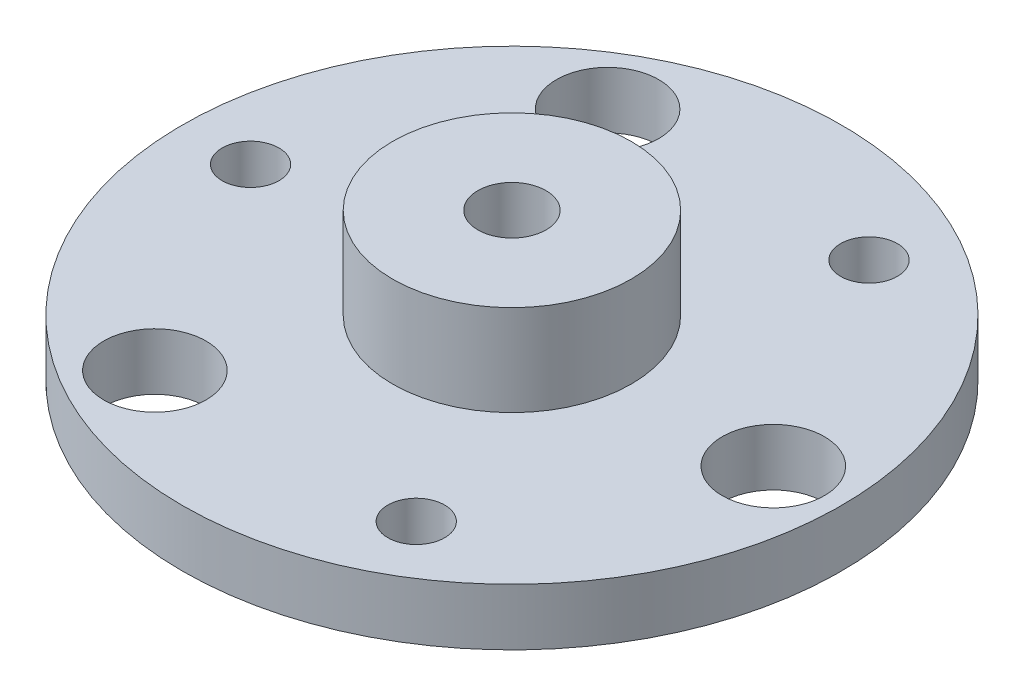
ISO-10303-21;
HEADER;
FILE_DESCRIPTION(('STEP AP214'),'2;1');
FILE_NAME('part.step','',(''),(''),'','','');
FILE_SCHEMA(('AUTOMOTIVE_DESIGN { 1 0 10303 214 1 1 1 1 }'));
ENDSEC;
DATA;
#1=APPLICATION_CONTEXT('core data for automotive mechanical design processes');
#2=APPLICATION_PROTOCOL_DEFINITION('international standard','automotive_design',2000,#1);
#3=PRODUCT_CONTEXT('',#1,'mechanical');
#4=PRODUCT('Part','Part','',(#3));
#5=PRODUCT_RELATED_PRODUCT_CATEGORY('part','',(#4));
#6=PRODUCT_DEFINITION_FORMATION('','',#4);
#7=PRODUCT_DEFINITION_CONTEXT('part definition',#1,'design');
#8=PRODUCT_DEFINITION('design','',#6,#7);
#9=PRODUCT_DEFINITION_SHAPE('','',#8);
#10=(LENGTH_UNIT() NAMED_UNIT(*) SI_UNIT(.MILLI.,.METRE.));
#11=(NAMED_UNIT(*) PLANE_ANGLE_UNIT() SI_UNIT($,.RADIAN.));
#12=(NAMED_UNIT(*) SI_UNIT($,.STERADIAN.) SOLID_ANGLE_UNIT());
#13=UNCERTAINTY_MEASURE_WITH_UNIT(LENGTH_MEASURE(1.E-05),#10,'distance_accuracy_value','');
#14=(GEOMETRIC_REPRESENTATION_CONTEXT(3) GLOBAL_UNCERTAINTY_ASSIGNED_CONTEXT((#13)) GLOBAL_UNIT_ASSIGNED_CONTEXT((#10,
#11,#12)) REPRESENTATION_CONTEXT('',''));
#15=CARTESIAN_POINT('',(0.,0.,0.));
#16=DIRECTION('',(0.,0.,1.));
#17=DIRECTION('',(1.,0.,0.));
#18=AXIS2_PLACEMENT_3D('',#15,#16,#17);
#19=CARTESIAN_POINT('',(0.,5.,0.));
#20=DIRECTION('',(0.,-1.,0.));
#21=DIRECTION('',(0.,0.,-1.));
#22=AXIS2_PLACEMENT_3D('',#19,#20,#21);
#23=CYLINDRICAL_SURFACE('',#22,29.);
#24=CARTESIAN_POINT('',(0.,5.,0.));
#25=DIRECTION('',(0.,1.,0.));
#26=DIRECTION('',(0.,0.,1.));
#27=AXIS2_PLACEMENT_3D('',#24,#25,#26);
#28=CIRCLE('',#27,29.);
#29=CARTESIAN_POINT('',(0.,5.,29.));
#30=VERTEX_POINT('',#29);
#31=EDGE_CURVE('E51',#30,#30,#28,.T.);
#32=ORIENTED_EDGE('',*,*,#31,.F.);
#33=EDGE_LOOP('',(#32));
#34=FACE_BOUND('',#33,.T.);
#35=CARTESIAN_POINT('',(0.,0.,0.));
#36=DIRECTION('',(0.,1.,0.));
#37=DIRECTION('',(0.,0.,1.));
#38=AXIS2_PLACEMENT_3D('',#35,#36,#37);
#39=CIRCLE('',#38,29.);
#40=CARTESIAN_POINT('',(0.,0.,29.));
#41=VERTEX_POINT('',#40);
#42=EDGE_CURVE('E55',#41,#41,#39,.T.);
#43=ORIENTED_EDGE('',*,*,#42,.T.);
#44=EDGE_LOOP('',(#43));
#45=FACE_BOUND('',#44,.T.);
#46=ADVANCED_FACE('F37',(#34,#45),#23,.T.);
#47=CARTESIAN_POINT('',(0.,5.,0.));
#48=DIRECTION('',(0.,1.,0.));
#49=DIRECTION('',(0.,0.,1.));
#50=AXIS2_PLACEMENT_3D('',#47,#48,#49);
#51=PLANE('',#50);
#52=CARTESIAN_POINT('',(-11.4999999999999,5.,19.9185842870421));
#53=DIRECTION('',(0.,1.,0.));
#54=DIRECTION('',(0.,0.,1.));
#55=AXIS2_PLACEMENT_3D('',#52,#53,#54);
#56=CIRCLE('',#55,4.5);
#57=CARTESIAN_POINT('',(-11.4999999999999,5.,24.4185842870421));
#58=VERTEX_POINT('',#57);
#59=EDGE_CURVE('E75',#58,#58,#56,.T.);
#60=ORIENTED_EDGE('',*,*,#59,.F.);
#61=EDGE_LOOP('',(#60));
#62=FACE_BOUND('',#61,.T.);
#63=CARTESIAN_POINT('',(-11.5000000000001,5.,-19.9185842870421));
#64=DIRECTION('',(0.,1.,0.));
#65=DIRECTION('',(0.,0.,1.));
#66=AXIS2_PLACEMENT_3D('',#63,#64,#65);
#67=CIRCLE('',#66,4.5);
#68=CARTESIAN_POINT('',(-11.5000000000001,5.,-15.4185842870421));
#69=VERTEX_POINT('',#68);
#70=EDGE_CURVE('E289',#69,#69,#67,.T.);
#71=ORIENTED_EDGE('',*,*,#70,.F.);
#72=EDGE_LOOP('',(#71));
#73=FACE_BOUND('',#72,.T.);
#74=CARTESIAN_POINT('',(23.,5.,0.));
#75=DIRECTION('',(0.,1.,0.));
#76=DIRECTION('',(0.,0.,1.));
#77=AXIS2_PLACEMENT_3D('',#74,#75,#76);
#78=CIRCLE('',#77,4.5);
#79=CARTESIAN_POINT('',(23.,5.,4.49999999999992));
#80=VERTEX_POINT('',#79);
#81=EDGE_CURVE('E285',#80,#80,#78,.T.);
#82=ORIENTED_EDGE('',*,*,#81,.F.);
#83=EDGE_LOOP('',(#82));
#84=FACE_BOUND('',#83,.T.);
#85=CARTESIAN_POINT('',(-23.,5.,0.));
#86=DIRECTION('',(0.,1.,0.));
#87=DIRECTION('',(0.,0.,1.));
#88=AXIS2_PLACEMENT_3D('',#85,#86,#87);
#89=CIRCLE('',#88,2.5);
#90=CARTESIAN_POINT('',(-23.,5.,2.5));
#91=VERTEX_POINT('',#90);
#92=EDGE_CURVE('E62',#91,#91,#89,.T.);
#93=ORIENTED_EDGE('',*,*,#92,.F.);
#94=EDGE_LOOP('',(#93));
#95=FACE_BOUND('',#94,.T.);
#96=CARTESIAN_POINT('',(11.5000000000004,5.,-19.9185842870419));
#97=DIRECTION('',(0.,1.,0.));
#98=DIRECTION('',(0.,0.,1.));
#99=AXIS2_PLACEMENT_3D('',#96,#97,#98);
#100=CIRCLE('',#99,2.5);
#101=CARTESIAN_POINT('',(11.5000000000004,5.,-17.4185842870419));
#102=VERTEX_POINT('',#101);
#103=EDGE_CURVE('E87',#102,#102,#100,.T.);
#104=ORIENTED_EDGE('',*,*,#103,.F.);
#105=EDGE_LOOP('',(#104));
#106=FACE_BOUND('',#105,.T.);
#107=CARTESIAN_POINT('',(11.5,5.,19.9185842870421));
#108=DIRECTION('',(0.,1.,0.));
#109=DIRECTION('',(0.,0.,1.));
#110=AXIS2_PLACEMENT_3D('',#107,#108,#109);
#111=CIRCLE('',#110,2.50000000000038);
#112=CARTESIAN_POINT('',(11.5,5.,22.4185842870425));
#113=VERTEX_POINT('',#112);
#114=EDGE_CURVE('E82',#113,#113,#111,.T.);
#115=ORIENTED_EDGE('',*,*,#114,.F.);
#116=EDGE_LOOP('',(#115));
#117=FACE_BOUND('',#116,.T.);
#118=CARTESIAN_POINT('',(0.,5.,0.));
#119=DIRECTION('',(0.,1.,0.));
#120=DIRECTION('',(0.,0.,1.));
#121=AXIS2_PLACEMENT_3D('',#118,#119,#120);
#122=CIRCLE('',#121,10.5);
#123=CARTESIAN_POINT('',(0.,5.,10.5));
#124=VERTEX_POINT('',#123);
#125=EDGE_CURVE('E45',#124,#124,#122,.T.);
#126=ORIENTED_EDGE('',*,*,#125,.F.);
#127=EDGE_LOOP('',(#126));
#128=FACE_BOUND('',#127,.T.);
#129=ORIENTED_EDGE('',*,*,#31,.T.);
#130=EDGE_LOOP('',(#129));
#131=FACE_BOUND('',#130,.T.);
#132=ADVANCED_FACE('F122',(#62,#73,#84,#95,#106,#117,#128,#131),#51,.T.);
#133=CARTESIAN_POINT('',(0.,0.,0.));
#134=DIRECTION('',(0.,1.,0.));
#135=DIRECTION('',(0.,0.,1.));
#136=AXIS2_PLACEMENT_3D('',#133,#134,#135);
#137=PLANE('',#136);
#138=CARTESIAN_POINT('',(-11.4999999999999,0.,19.9185842870421));
#139=DIRECTION('',(0.,1.,0.));
#140=DIRECTION('',(0.,0.,1.));
#141=AXIS2_PLACEMENT_3D('',#138,#139,#140);
#142=CIRCLE('',#141,4.5);
#143=CARTESIAN_POINT('',(-11.4999999999999,0.,24.4185842870421));
#144=VERTEX_POINT('',#143);
#145=EDGE_CURVE('E40',#144,#144,#142,.T.);
#146=ORIENTED_EDGE('',*,*,#145,.T.);
#147=EDGE_LOOP('',(#146));
#148=FACE_BOUND('',#147,.T.);
#149=CARTESIAN_POINT('',(-11.5000000000001,0.,-19.9185842870421));
#150=DIRECTION('',(0.,1.,0.));
#151=DIRECTION('',(0.,0.,1.));
#152=AXIS2_PLACEMENT_3D('',#149,#150,#151);
#153=CIRCLE('',#152,4.5);
#154=CARTESIAN_POINT('',(-11.5000000000001,0.,-15.4185842870421));
#155=VERTEX_POINT('',#154);
#156=EDGE_CURVE('E74',#155,#155,#153,.T.);
#157=ORIENTED_EDGE('',*,*,#156,.T.);
#158=EDGE_LOOP('',(#157));
#159=FACE_BOUND('',#158,.T.);
#160=CARTESIAN_POINT('',(23.,0.,0.));
#161=DIRECTION('',(0.,1.,0.));
#162=DIRECTION('',(0.,0.,1.));
#163=AXIS2_PLACEMENT_3D('',#160,#161,#162);
#164=CIRCLE('',#163,4.5);
#165=CARTESIAN_POINT('',(23.,0.,4.49999999999992));
#166=VERTEX_POINT('',#165);
#167=EDGE_CURVE('E71',#166,#166,#164,.T.);
#168=ORIENTED_EDGE('',*,*,#167,.T.);
#169=EDGE_LOOP('',(#168));
#170=FACE_BOUND('',#169,.T.);
#171=CARTESIAN_POINT('',(-23.,0.,0.));
#172=DIRECTION('',(0.,1.,0.));
#173=DIRECTION('',(0.,0.,1.));
#174=AXIS2_PLACEMENT_3D('',#171,#172,#173);
#175=CIRCLE('',#174,2.5);
#176=CARTESIAN_POINT('',(-23.,0.,2.5));
#177=VERTEX_POINT('',#176);
#178=EDGE_CURVE('E66',#177,#177,#175,.T.);
#179=ORIENTED_EDGE('',*,*,#178,.T.);
#180=EDGE_LOOP('',(#179));
#181=FACE_BOUND('',#180,.T.);
#182=CARTESIAN_POINT('',(11.5000000000004,0.,-19.9185842870419));
#183=DIRECTION('',(0.,1.,0.));
#184=DIRECTION('',(0.,0.,1.));
#185=AXIS2_PLACEMENT_3D('',#182,#183,#184);
#186=CIRCLE('',#185,2.5);
#187=CARTESIAN_POINT('',(11.5000000000004,0.,-17.4185842870419));
#188=VERTEX_POINT('',#187);
#189=EDGE_CURVE('E61',#188,#188,#186,.T.);
#190=ORIENTED_EDGE('',*,*,#189,.T.);
#191=EDGE_LOOP('',(#190));
#192=FACE_BOUND('',#191,.T.);
#193=CARTESIAN_POINT('',(11.5,0.,19.9185842870421));
#194=DIRECTION('',(0.,1.,0.));
#195=DIRECTION('',(0.,0.,1.));
#196=AXIS2_PLACEMENT_3D('',#193,#194,#195);
#197=CIRCLE('',#196,2.50000000000038);
#198=CARTESIAN_POINT('',(11.5,0.,22.4185842870425));
#199=VERTEX_POINT('',#198);
#200=EDGE_CURVE('E57',#199,#199,#197,.T.);
#201=ORIENTED_EDGE('',*,*,#200,.T.);
#202=EDGE_LOOP('',(#201));
#203=FACE_BOUND('',#202,.T.);
#204=CARTESIAN_POINT('',(0.,0.,0.));
#205=DIRECTION('',(0.,1.,0.));
#206=DIRECTION('',(0.,0.,1.));
#207=AXIS2_PLACEMENT_3D('',#204,#205,#206);
#208=CIRCLE('',#207,10.);
#209=CARTESIAN_POINT('',(0.,0.,10.));
#210=VERTEX_POINT('',#209);
#211=EDGE_CURVE('E10',#210,#210,#208,.F.);
#212=ORIENTED_EDGE('',*,*,#211,.F.);
#213=EDGE_LOOP('',(#212));
#214=FACE_BOUND('',#213,.T.);
#215=ORIENTED_EDGE('',*,*,#42,.F.);
#216=EDGE_LOOP('',(#215));
#217=FACE_BOUND('',#216,.T.);
#218=ADVANCED_FACE('F119',(#148,#159,#170,#181,#192,#203,#214,#217),#137,.F.);
#219=CARTESIAN_POINT('',(0.,13.,0.));
#220=DIRECTION('',(0.,-1.,0.));
#221=DIRECTION('',(0.,0.,-1.));
#222=AXIS2_PLACEMENT_3D('',#219,#220,#221);
#223=CYLINDRICAL_SURFACE('',#222,10.5);
#224=CARTESIAN_POINT('',(0.,13.,0.));
#225=DIRECTION('',(0.,1.,0.));
#226=DIRECTION('',(0.,0.,1.));
#227=AXIS2_PLACEMENT_3D('',#224,#225,#226);
#228=CIRCLE('',#227,10.5);
#229=CARTESIAN_POINT('',(0.,13.,10.5));
#230=VERTEX_POINT('',#229);
#231=EDGE_CURVE('E107',#230,#230,#228,.T.);
#232=ORIENTED_EDGE('',*,*,#231,.F.);
#233=EDGE_LOOP('',(#232));
#234=FACE_BOUND('',#233,.T.);
#235=ORIENTED_EDGE('',*,*,#125,.T.);
#236=EDGE_LOOP('',(#235));
#237=FACE_BOUND('',#236,.T.);
#238=ADVANCED_FACE('F121',(#234,#237),#223,.T.);
#239=CARTESIAN_POINT('',(0.,13.,0.));
#240=DIRECTION('',(0.,1.,0.));
#241=DIRECTION('',(0.,0.,1.));
#242=AXIS2_PLACEMENT_3D('',#239,#240,#241);
#243=PLANE('',#242);
#244=CARTESIAN_POINT('',(0.,13.,0.));
#245=DIRECTION('',(0.,1.,0.));
#246=DIRECTION('',(0.,0.,1.));
#247=AXIS2_PLACEMENT_3D('',#244,#245,#246);
#248=CIRCLE('',#247,3.);
#249=CARTESIAN_POINT('',(0.,13.,3.));
#250=VERTEX_POINT('',#249);
#251=EDGE_CURVE('E103',#250,#250,#248,.T.);
#252=ORIENTED_EDGE('',*,*,#251,.F.);
#253=EDGE_LOOP('',(#252));
#254=FACE_BOUND('',#253,.T.);
#255=ORIENTED_EDGE('',*,*,#231,.T.);
#256=EDGE_LOOP('',(#255));
#257=FACE_BOUND('',#256,.T.);
#258=ADVANCED_FACE('F127',(#254,#257),#243,.T.);
#259=CARTESIAN_POINT('',(0.,0.,0.));
#260=DIRECTION('',(0.,1.,0.));
#261=DIRECTION('',(0.,0.,1.));
#262=AXIS2_PLACEMENT_3D('',#259,#260,#261);
#263=CYLINDRICAL_SURFACE('',#262,3.);
#264=ORIENTED_EDGE('',*,*,#251,.T.);
#265=EDGE_LOOP('',(#264));
#266=FACE_BOUND('',#265,.T.);
#267=CARTESIAN_POINT('',(0.,-7.,0.));
#268=DIRECTION('',(0.,1.,0.));
#269=DIRECTION('',(0.,0.,1.));
#270=AXIS2_PLACEMENT_3D('',#267,#268,#269);
#271=CIRCLE('',#270,3.);
#272=CARTESIAN_POINT('',(0.,-7.,3.));
#273=VERTEX_POINT('',#272);
#274=EDGE_CURVE('E70',#273,#273,#271,.T.);
#275=ORIENTED_EDGE('',*,*,#274,.F.);
#276=EDGE_LOOP('',(#275));
#277=FACE_BOUND('',#276,.T.);
#278=ADVANCED_FACE('F205',(#266,#277),#263,.F.);
#279=CARTESIAN_POINT('',(0.,-7.,0.));
#280=DIRECTION('',(0.,1.,0.));
#281=DIRECTION('',(0.,0.,1.));
#282=AXIS2_PLACEMENT_3D('',#279,#280,#281);
#283=CYLINDRICAL_SURFACE('',#282,10.);
#284=CARTESIAN_POINT('',(0.,-7.,0.));
#285=DIRECTION('',(0.,-1.,0.));
#286=DIRECTION('',(0.,0.,-1.));
#287=AXIS2_PLACEMENT_3D('',#284,#285,#286);
#288=CIRCLE('',#287,10.);
#289=CARTESIAN_POINT('',(0.,-7.,-10.));
#290=VERTEX_POINT('',#289);
#291=EDGE_CURVE('E99',#290,#290,#288,.T.);
#292=ORIENTED_EDGE('',*,*,#291,.F.);
#293=EDGE_LOOP('',(#292));
#294=FACE_BOUND('',#293,.T.);
#295=ORIENTED_EDGE('',*,*,#211,.T.);
#296=EDGE_LOOP('',(#295));
#297=FACE_BOUND('',#296,.T.);
#298=ADVANCED_FACE('F201',(#294,#297),#283,.T.);
#299=CARTESIAN_POINT('',(0.,-7.,0.));
#300=DIRECTION('',(0.,-1.,0.));
#301=DIRECTION('',(0.,0.,-1.));
#302=AXIS2_PLACEMENT_3D('',#299,#300,#301);
#303=PLANE('',#302);
#304=ORIENTED_EDGE('',*,*,#274,.T.);
#305=EDGE_LOOP('',(#304));
#306=FACE_BOUND('',#305,.T.);
#307=ORIENTED_EDGE('',*,*,#291,.T.);
#308=EDGE_LOOP('',(#307));
#309=FACE_BOUND('',#308,.T.);
#310=ADVANCED_FACE('F198',(#306,#309),#303,.T.);
#311=CARTESIAN_POINT('',(11.5,-7.,19.9185842870421));
#312=DIRECTION('',(0.,1.,0.));
#313=DIRECTION('',(0.,0.,1.));
#314=AXIS2_PLACEMENT_3D('',#311,#312,#313);
#315=CYLINDRICAL_SURFACE('',#314,2.50000000000038);
#316=ORIENTED_EDGE('',*,*,#114,.T.);
#317=EDGE_LOOP('',(#316));
#318=FACE_BOUND('',#317,.T.);
#319=ORIENTED_EDGE('',*,*,#200,.F.);
#320=EDGE_LOOP('',(#319));
#321=FACE_BOUND('',#320,.T.);
#322=ADVANCED_FACE('F194',(#318,#321),#315,.F.);
#323=CARTESIAN_POINT('',(11.5000000000004,-7.,-19.9185842870419));
#324=DIRECTION('',(0.,1.,0.));
#325=DIRECTION('',(0.,0.,1.));
#326=AXIS2_PLACEMENT_3D('',#323,#324,#325);
#327=CYLINDRICAL_SURFACE('',#326,2.5);
#328=ORIENTED_EDGE('',*,*,#103,.T.);
#329=EDGE_LOOP('',(#328));
#330=FACE_BOUND('',#329,.T.);
#331=ORIENTED_EDGE('',*,*,#189,.F.);
#332=EDGE_LOOP('',(#331));
#333=FACE_BOUND('',#332,.T.);
#334=ADVANCED_FACE('F190',(#330,#333),#327,.F.);
#335=CARTESIAN_POINT('',(-23.,-7.,0.));
#336=DIRECTION('',(0.,1.,0.));
#337=DIRECTION('',(0.,0.,1.));
#338=AXIS2_PLACEMENT_3D('',#335,#336,#337);
#339=CYLINDRICAL_SURFACE('',#338,2.5);
#340=ORIENTED_EDGE('',*,*,#92,.T.);
#341=EDGE_LOOP('',(#340));
#342=FACE_BOUND('',#341,.T.);
#343=ORIENTED_EDGE('',*,*,#178,.F.);
#344=EDGE_LOOP('',(#343));
#345=FACE_BOUND('',#344,.T.);
#346=ADVANCED_FACE('F147',(#342,#345),#339,.F.);
#347=CARTESIAN_POINT('',(23.,-7.,0.));
#348=DIRECTION('',(0.,1.,0.));
#349=DIRECTION('',(0.,0.,1.));
#350=AXIS2_PLACEMENT_3D('',#347,#348,#349);
#351=CYLINDRICAL_SURFACE('',#350,4.5);
#352=ORIENTED_EDGE('',*,*,#81,.T.);
#353=EDGE_LOOP('',(#352));
#354=FACE_BOUND('',#353,.T.);
#355=ORIENTED_EDGE('',*,*,#167,.F.);
#356=EDGE_LOOP('',(#355));
#357=FACE_BOUND('',#356,.T.);
#358=ADVANCED_FACE('F157',(#354,#357),#351,.F.);
#359=CARTESIAN_POINT('',(-11.5000000000001,-7.,-19.9185842870421));
#360=DIRECTION('',(0.,1.,0.));
#361=DIRECTION('',(0.,0.,1.));
#362=AXIS2_PLACEMENT_3D('',#359,#360,#361);
#363=CYLINDRICAL_SURFACE('',#362,4.5);
#364=ORIENTED_EDGE('',*,*,#70,.T.);
#365=EDGE_LOOP('',(#364));
#366=FACE_BOUND('',#365,.T.);
#367=ORIENTED_EDGE('',*,*,#156,.F.);
#368=EDGE_LOOP('',(#367));
#369=FACE_BOUND('',#368,.T.);
#370=ADVANCED_FACE('F162',(#366,#369),#363,.F.);
#371=CARTESIAN_POINT('',(-11.4999999999999,-7.,19.9185842870421));
#372=DIRECTION('',(0.,1.,0.));
#373=DIRECTION('',(0.,0.,1.));
#374=AXIS2_PLACEMENT_3D('',#371,#372,#373);
#375=CYLINDRICAL_SURFACE('',#374,4.5);
#376=ORIENTED_EDGE('',*,*,#59,.T.);
#377=EDGE_LOOP('',(#376));
#378=FACE_BOUND('',#377,.T.);
#379=ORIENTED_EDGE('',*,*,#145,.F.);
#380=EDGE_LOOP('',(#379));
#381=FACE_BOUND('',#380,.T.);
#382=ADVANCED_FACE('F172',(#378,#381),#375,.F.);
#383=CLOSED_SHELL('',(#46,#132,#218,#238,#258,#278,#298,#310,#322,#334,#346,#358,#370,#382));
#384=MANIFOLD_SOLID_BREP('B2',#383);
#385=ADVANCED_BREP_SHAPE_REPRESENTATION('',(#18,#384),#14);
#386=SHAPE_DEFINITION_REPRESENTATION(#9,#385);
ENDSEC;
END-ISO-10303-21;
